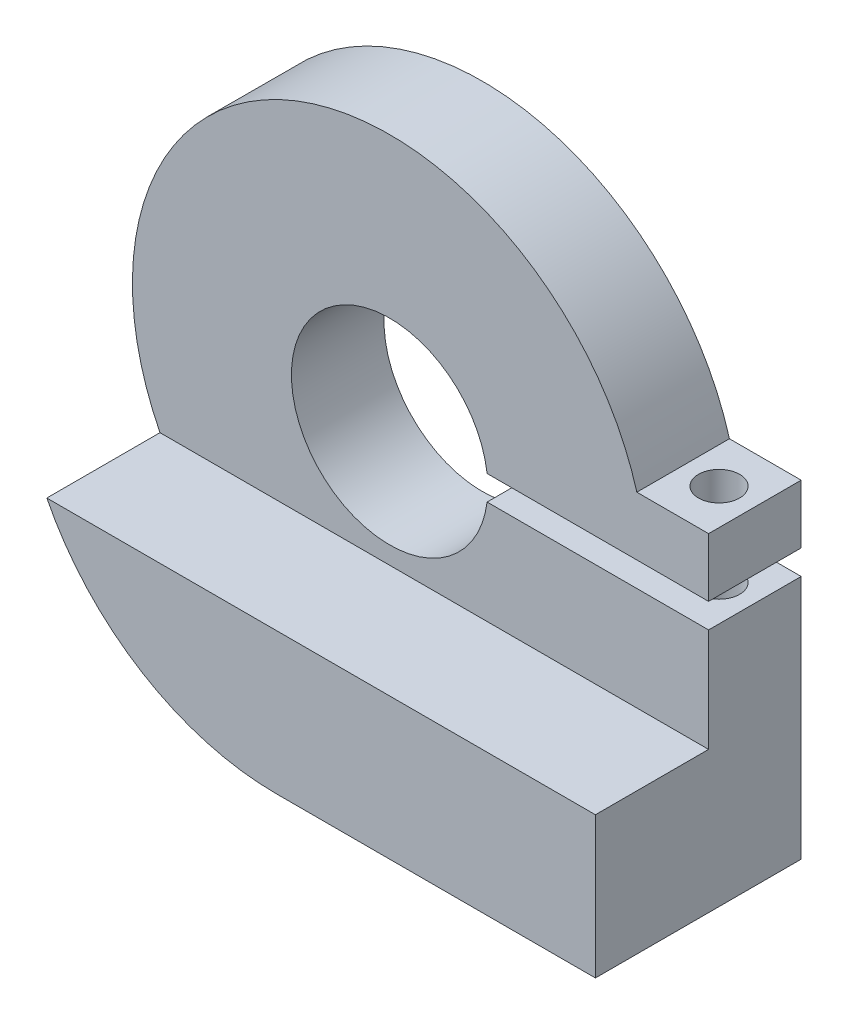
ISO-10303-21;
HEADER;
FILE_DESCRIPTION(('STEP AP214'),'2;1');
FILE_NAME('part.step','',(''),(''),'','','');
FILE_SCHEMA(('AUTOMOTIVE_DESIGN { 1 0 10303 214 1 1 1 1 }'));
ENDSEC;
DATA;
#1=APPLICATION_CONTEXT('core data for automotive mechanical design processes');
#2=APPLICATION_PROTOCOL_DEFINITION('international standard','automotive_design',2000,#1);
#3=PRODUCT_CONTEXT('',#1,'mechanical');
#4=PRODUCT('Part','Part','',(#3));
#5=PRODUCT_RELATED_PRODUCT_CATEGORY('part','',(#4));
#6=PRODUCT_DEFINITION_FORMATION('','',#4);
#7=PRODUCT_DEFINITION_CONTEXT('part definition',#1,'design');
#8=PRODUCT_DEFINITION('design','',#6,#7);
#9=PRODUCT_DEFINITION_SHAPE('','',#8);
#10=(LENGTH_UNIT() NAMED_UNIT(*) SI_UNIT(.MILLI.,.METRE.));
#11=(NAMED_UNIT(*) PLANE_ANGLE_UNIT() SI_UNIT($,.RADIAN.));
#12=(NAMED_UNIT(*) SI_UNIT($,.STERADIAN.) SOLID_ANGLE_UNIT());
#13=UNCERTAINTY_MEASURE_WITH_UNIT(LENGTH_MEASURE(1.E-05),#10,'distance_accuracy_value','');
#14=(GEOMETRIC_REPRESENTATION_CONTEXT(3) GLOBAL_UNCERTAINTY_ASSIGNED_CONTEXT((#13)) GLOBAL_UNIT_ASSIGNED_CONTEXT((#10,
#11,#12)) REPRESENTATION_CONTEXT('',''));
#15=CARTESIAN_POINT('',(0.,0.,0.));
#16=DIRECTION('',(0.,0.,1.));
#17=DIRECTION('',(1.,0.,0.));
#18=AXIS2_PLACEMENT_3D('',#15,#16,#17);
#19=CARTESIAN_POINT('',(15.5,0.6,4.5));
#20=DIRECTION('',(0.,-1.,0.));
#21=DIRECTION('',(0.,0.,-1.));
#22=AXIS2_PLACEMENT_3D('',#19,#20,#21);
#23=PLANE('',#22);
#24=CARTESIAN_POINT('',(13.7568758236732,0.6,2.25));
#25=DIRECTION('',(0.,-1.,0.));
#26=DIRECTION('',(0.,0.,-1.));
#27=AXIS2_PLACEMENT_3D('',#24,#25,#26);
#28=CIRCLE('',#27,1.);
#29=CARTESIAN_POINT('',(13.7568758236732,0.6,1.25));
#30=VERTEX_POINT('',#29);
#31=EDGE_CURVE('E256',#30,#30,#28,.T.);
#32=ORIENTED_EDGE('',*,*,#31,.F.);
#33=EDGE_LOOP('',(#32));
#34=FACE_BOUND('',#33,.T.);
#35=DIRECTION('',(-1.,0.,0.));
#36=VECTOR('',#35,1.);
#37=CARTESIAN_POINT('',(15.5,0.6,0.));
#38=LINE('',#37,#36);
#39=CARTESIAN_POINT('',(15.5,0.6,0.));
#40=VERTEX_POINT('',#39);
#41=CARTESIAN_POINT('',(4.73595100690393,0.6,0.));
#42=VERTEX_POINT('',#41);
#43=EDGE_CURVE('E153',#40,#42,#38,.T.);
#44=ORIENTED_EDGE('',*,*,#43,.F.);
#45=DIRECTION('',(0.,0.,-1.));
#46=VECTOR('',#45,1.);
#47=CARTESIAN_POINT('',(15.5,0.6,4.5));
#48=LINE('',#47,#46);
#49=CARTESIAN_POINT('',(15.5,0.6,4.5));
#50=VERTEX_POINT('',#49);
#51=EDGE_CURVE('E11',#50,#40,#48,.T.);
#52=ORIENTED_EDGE('',*,*,#51,.F.);
#53=DIRECTION('',(-1.,0.,0.));
#54=VECTOR('',#53,1.);
#55=CARTESIAN_POINT('',(15.5,0.6,4.5));
#56=LINE('',#55,#54);
#57=CARTESIAN_POINT('',(4.73595100690393,0.6,4.5));
#58=VERTEX_POINT('',#57);
#59=EDGE_CURVE('E179',#50,#58,#56,.T.);
#60=ORIENTED_EDGE('',*,*,#59,.T.);
#61=DIRECTION('',(0.,0.,-1.));
#62=VECTOR('',#61,1.);
#63=CARTESIAN_POINT('',(4.73595100690393,0.6,4.5));
#64=LINE('',#63,#62);
#65=EDGE_CURVE('E105',#58,#42,#64,.T.);
#66=ORIENTED_EDGE('',*,*,#65,.T.);
#67=EDGE_LOOP('',(#44,#52,#60,#66));
#68=FACE_BOUND('',#67,.T.);
#69=ADVANCED_FACE('F43',(#34,#68),#23,.T.);
#70=CARTESIAN_POINT('',(15.5,0.6,4.5));
#71=DIRECTION('',(-1.,0.,0.));
#72=DIRECTION('',(0.,0.,1.));
#73=AXIS2_PLACEMENT_3D('',#70,#71,#72);
#74=PLANE('',#73);
#75=DIRECTION('',(0.,1.,0.));
#76=VECTOR('',#75,1.);
#77=CARTESIAN_POINT('',(15.5,0.6,0.));
#78=LINE('',#77,#76);
#79=CARTESIAN_POINT('',(15.5,3.45250218767224,0.));
#80=VERTEX_POINT('',#79);
#81=EDGE_CURVE('E177',#40,#80,#78,.T.);
#82=ORIENTED_EDGE('',*,*,#81,.T.);
#83=DIRECTION('',(0.,0.,-1.));
#84=VECTOR('',#83,1.);
#85=CARTESIAN_POINT('',(15.5,3.45250218767224,4.5));
#86=LINE('',#85,#84);
#87=CARTESIAN_POINT('',(15.5,3.45250218767224,4.5));
#88=VERTEX_POINT('',#87);
#89=EDGE_CURVE('E52',#88,#80,#86,.T.);
#90=ORIENTED_EDGE('',*,*,#89,.F.);
#91=DIRECTION('',(0.,1.,0.));
#92=VECTOR('',#91,1.);
#93=CARTESIAN_POINT('',(15.5,0.6,4.5));
#94=LINE('',#93,#92);
#95=EDGE_CURVE('E122',#50,#88,#94,.T.);
#96=ORIENTED_EDGE('',*,*,#95,.F.);
#97=ORIENTED_EDGE('',*,*,#51,.T.);
#98=EDGE_LOOP('',(#82,#90,#96,#97));
#99=FACE_BOUND('',#98,.T.);
#100=ADVANCED_FACE('F202',(#99),#74,.F.);
#101=CARTESIAN_POINT('',(15.5,3.45250218767224,4.5));
#102=DIRECTION('',(0.,-1.,0.));
#103=DIRECTION('',(1.,0.,0.));
#104=AXIS2_PLACEMENT_3D('',#101,#102,#103);
#105=PLANE('',#104);
#106=CARTESIAN_POINT('',(13.7568758236732,3.45250218767224,2.25));
#107=DIRECTION('',(0.,1.,0.));
#108=DIRECTION('',(-1.,0.,0.));
#109=AXIS2_PLACEMENT_3D('',#106,#107,#108);
#110=CIRCLE('',#109,1.);
#111=CARTESIAN_POINT('',(12.7568758236732,3.45250218767224,2.25));
#112=VERTEX_POINT('',#111);
#113=EDGE_CURVE('E263',#112,#112,#110,.T.);
#114=ORIENTED_EDGE('',*,*,#113,.F.);
#115=EDGE_LOOP('',(#114));
#116=FACE_BOUND('',#115,.T.);
#117=DIRECTION('',(-1.,0.,0.));
#118=VECTOR('',#117,1.);
#119=CARTESIAN_POINT('',(15.5,3.45250218767224,0.));
#120=LINE('',#119,#118);
#121=CARTESIAN_POINT('',(12.0137516473464,3.45250218767224,0.));
#122=VERTEX_POINT('',#121);
#123=EDGE_CURVE('E132',#80,#122,#120,.T.);
#124=ORIENTED_EDGE('',*,*,#123,.T.);
#125=DIRECTION('',(0.,0.,-1.));
#126=VECTOR('',#125,1.);
#127=CARTESIAN_POINT('',(12.0137516473464,3.45250218767224,4.5));
#128=LINE('',#127,#126);
#129=CARTESIAN_POINT('',(12.0137516473464,3.45250218767224,4.5));
#130=VERTEX_POINT('',#129);
#131=EDGE_CURVE('E129',#130,#122,#128,.T.);
#132=ORIENTED_EDGE('',*,*,#131,.F.);
#133=DIRECTION('',(-1.,0.,0.));
#134=VECTOR('',#133,1.);
#135=CARTESIAN_POINT('',(15.5,3.45250218767224,4.5));
#136=LINE('',#135,#134);
#137=EDGE_CURVE('E116',#88,#130,#136,.T.);
#138=ORIENTED_EDGE('',*,*,#137,.F.);
#139=ORIENTED_EDGE('',*,*,#89,.T.);
#140=EDGE_LOOP('',(#124,#132,#138,#139));
#141=FACE_BOUND('',#140,.T.);
#142=ADVANCED_FACE('F130',(#116,#141),#105,.F.);
#143=CARTESIAN_POINT('',(0.,0.,4.5));
#144=DIRECTION('',(0.,0.,-1.));
#145=DIRECTION('',(-1.,0.,0.));
#146=AXIS2_PLACEMENT_3D('',#143,#144,#145);
#147=CYLINDRICAL_SURFACE('',#146,12.5);
#148=CARTESIAN_POINT('',(0.,0.,0.));
#149=DIRECTION('',(0.,0.,1.));
#150=DIRECTION('',(1.,0.,0.));
#151=AXIS2_PLACEMENT_3D('',#148,#149,#150);
#152=CIRCLE('',#151,12.5);
#153=CARTESIAN_POINT('',(0.,-12.5,0.));
#154=VERTEX_POINT('',#153);
#155=EDGE_CURVE('E172',#122,#154,#152,.T.);
#156=ORIENTED_EDGE('',*,*,#155,.T.);
#157=DIRECTION('',(0.,0.,-1.));
#158=VECTOR('',#157,1.);
#159=CARTESIAN_POINT('',(0.,-12.5,4.5));
#160=LINE('',#159,#158);
#161=CARTESIAN_POINT('',(0.,-12.5,10.));
#162=VERTEX_POINT('',#161);
#163=EDGE_CURVE('E136',#162,#154,#160,.T.);
#164=ORIENTED_EDGE('',*,*,#163,.F.);
#165=CARTESIAN_POINT('',(0.,0.,10.));
#166=DIRECTION('',(0.,0.,1.));
#167=DIRECTION('',(1.,0.,0.));
#168=AXIS2_PLACEMENT_3D('',#165,#166,#167);
#169=CIRCLE('',#168,12.5);
#170=CARTESIAN_POINT('',(-11.1609537814563,-5.62877523873498,10.));
#171=VERTEX_POINT('',#170);
#172=EDGE_CURVE('E245',#171,#162,#169,.T.);
#173=ORIENTED_EDGE('',*,*,#172,.F.);
#174=DIRECTION('',(0.,0.,-1.));
#175=VECTOR('',#174,1.);
#176=CARTESIAN_POINT('',(-11.1609537814563,-5.62877523873498,10.));
#177=LINE('',#176,#175);
#178=CARTESIAN_POINT('',(-11.1609537814563,-5.62877523873498,4.5));
#179=VERTEX_POINT('',#178);
#180=EDGE_CURVE('E142',#171,#179,#177,.T.);
#181=ORIENTED_EDGE('',*,*,#180,.T.);
#182=CARTESIAN_POINT('',(0.,0.,4.5));
#183=DIRECTION('',(0.,0.,1.));
#184=DIRECTION('',(1.,0.,0.));
#185=AXIS2_PLACEMENT_3D('',#182,#183,#184);
#186=CIRCLE('',#185,12.5);
#187=EDGE_CURVE('E120',#130,#179,#186,.T.);
#188=ORIENTED_EDGE('',*,*,#187,.F.);
#189=ORIENTED_EDGE('',*,*,#131,.T.);
#190=EDGE_LOOP('',(#156,#164,#173,#181,#188,#189));
#191=FACE_BOUND('',#190,.T.);
#192=ADVANCED_FACE('F139',(#191),#147,.T.);
#193=CARTESIAN_POINT('',(0.,-12.5,4.5));
#194=DIRECTION('',(0.,1.,0.));
#195=DIRECTION('',(0.,0.,1.));
#196=AXIS2_PLACEMENT_3D('',#193,#194,#195);
#197=PLANE('',#196);
#198=DIRECTION('',(1.,0.,0.));
#199=VECTOR('',#198,1.);
#200=CARTESIAN_POINT('',(0.,-12.5,0.));
#201=LINE('',#200,#199);
#202=CARTESIAN_POINT('',(15.5,-12.5,0.));
#203=VERTEX_POINT('',#202);
#204=EDGE_CURVE('E169',#154,#203,#201,.T.);
#205=ORIENTED_EDGE('',*,*,#204,.T.);
#206=DIRECTION('',(0.,0.,-1.));
#207=VECTOR('',#206,1.);
#208=CARTESIAN_POINT('',(15.5,-12.5,4.5));
#209=LINE('',#208,#207);
#210=CARTESIAN_POINT('',(15.5,-12.5,10.));
#211=VERTEX_POINT('',#210);
#212=EDGE_CURVE('E186',#211,#203,#209,.T.);
#213=ORIENTED_EDGE('',*,*,#212,.F.);
#214=DIRECTION('',(-1.,0.,0.));
#215=VECTOR('',#214,1.);
#216=CARTESIAN_POINT('',(15.5,-12.5,10.));
#217=LINE('',#216,#215);
#218=EDGE_CURVE('E229',#211,#162,#217,.T.);
#219=ORIENTED_EDGE('',*,*,#218,.T.);
#220=ORIENTED_EDGE('',*,*,#163,.T.);
#221=EDGE_LOOP('',(#205,#213,#219,#220));
#222=FACE_BOUND('',#221,.T.);
#223=ADVANCED_FACE('F227',(#222),#197,.F.);
#224=CARTESIAN_POINT('',(15.5,-12.5,4.5));
#225=DIRECTION('',(-1.,0.,0.));
#226=DIRECTION('',(0.,0.,1.));
#227=AXIS2_PLACEMENT_3D('',#224,#225,#226);
#228=PLANE('',#227);
#229=DIRECTION('',(0.,1.,0.));
#230=VECTOR('',#229,1.);
#231=CARTESIAN_POINT('',(15.5,-12.5,0.));
#232=LINE('',#231,#230);
#233=CARTESIAN_POINT('',(15.5,-0.6,0.));
#234=VERTEX_POINT('',#233);
#235=EDGE_CURVE('E166',#203,#234,#232,.T.);
#236=ORIENTED_EDGE('',*,*,#235,.T.);
#237=DIRECTION('',(0.,0.,-1.));
#238=VECTOR('',#237,1.);
#239=CARTESIAN_POINT('',(15.5,-0.6,4.5));
#240=LINE('',#239,#238);
#241=CARTESIAN_POINT('',(15.5,-0.6,4.5));
#242=VERTEX_POINT('',#241);
#243=EDGE_CURVE('E190',#242,#234,#240,.T.);
#244=ORIENTED_EDGE('',*,*,#243,.F.);
#245=DIRECTION('',(0.,1.,0.));
#246=VECTOR('',#245,1.);
#247=CARTESIAN_POINT('',(15.5,-12.5,4.5));
#248=LINE('',#247,#246);
#249=CARTESIAN_POINT('',(15.5,-5.62877523873498,4.5));
#250=VERTEX_POINT('',#249);
#251=EDGE_CURVE('E144',#250,#242,#248,.T.);
#252=ORIENTED_EDGE('',*,*,#251,.F.);
#253=DIRECTION('',(0.,0.,-1.));
#254=VECTOR('',#253,1.);
#255=CARTESIAN_POINT('',(15.5,-5.62877523873498,10.));
#256=LINE('',#255,#254);
#257=CARTESIAN_POINT('',(15.5,-5.62877523873498,10.));
#258=VERTEX_POINT('',#257);
#259=EDGE_CURVE('E158',#258,#250,#256,.T.);
#260=ORIENTED_EDGE('',*,*,#259,.F.);
#261=DIRECTION('',(0.,1.,0.));
#262=VECTOR('',#261,1.);
#263=CARTESIAN_POINT('',(15.5,-12.5,10.));
#264=LINE('',#263,#262);
#265=EDGE_CURVE('E223',#211,#258,#264,.T.);
#266=ORIENTED_EDGE('',*,*,#265,.F.);
#267=ORIENTED_EDGE('',*,*,#212,.T.);
#268=EDGE_LOOP('',(#236,#244,#252,#260,#266,#267));
#269=FACE_BOUND('',#268,.T.);
#270=ADVANCED_FACE('F218',(#269),#228,.F.);
#271=CARTESIAN_POINT('',(15.5,-0.6,4.5));
#272=DIRECTION('',(0.,-1.,0.));
#273=DIRECTION('',(0.,0.,-1.));
#274=AXIS2_PLACEMENT_3D('',#271,#272,#273);
#275=PLANE('',#274);
#276=CARTESIAN_POINT('',(13.7568758236732,-0.6,2.25));
#277=DIRECTION('',(0.,-1.,0.));
#278=DIRECTION('',(0.,0.,-1.));
#279=AXIS2_PLACEMENT_3D('',#276,#277,#278);
#280=CIRCLE('',#279,1.);
#281=CARTESIAN_POINT('',(13.7568758236732,-0.6,1.25));
#282=VERTEX_POINT('',#281);
#283=EDGE_CURVE('E46',#282,#282,#280,.T.);
#284=ORIENTED_EDGE('',*,*,#283,.T.);
#285=EDGE_LOOP('',(#284));
#286=FACE_BOUND('',#285,.T.);
#287=DIRECTION('',(-1.,0.,0.));
#288=VECTOR('',#287,1.);
#289=CARTESIAN_POINT('',(15.5,-0.6,0.));
#290=LINE('',#289,#288);
#291=CARTESIAN_POINT('',(4.73595100690393,-0.600000000000003,0.));
#292=VERTEX_POINT('',#291);
#293=EDGE_CURVE('E162',#234,#292,#290,.T.);
#294=ORIENTED_EDGE('',*,*,#293,.T.);
#295=DIRECTION('',(0.,0.,-1.));
#296=VECTOR('',#295,1.);
#297=CARTESIAN_POINT('',(4.73595100690393,-0.600000000000003,4.5));
#298=LINE('',#297,#296);
#299=CARTESIAN_POINT('',(4.73595100690393,-0.600000000000003,4.5));
#300=VERTEX_POINT('',#299);
#301=EDGE_CURVE('E194',#300,#292,#298,.T.);
#302=ORIENTED_EDGE('',*,*,#301,.F.);
#303=DIRECTION('',(-1.,0.,0.));
#304=VECTOR('',#303,1.);
#305=CARTESIAN_POINT('',(15.5,-0.6,4.5));
#306=LINE('',#305,#304);
#307=EDGE_CURVE('E147',#242,#300,#306,.T.);
#308=ORIENTED_EDGE('',*,*,#307,.F.);
#309=ORIENTED_EDGE('',*,*,#243,.T.);
#310=EDGE_LOOP('',(#294,#302,#308,#309));
#311=FACE_BOUND('',#310,.T.);
#312=ADVANCED_FACE('F214',(#286,#311),#275,.F.);
#313=CARTESIAN_POINT('',(0.,0.,4.5));
#314=DIRECTION('',(0.,0.,-1.));
#315=DIRECTION('',(-1.,0.,0.));
#316=AXIS2_PLACEMENT_3D('',#313,#314,#315);
#317=CYLINDRICAL_SURFACE('',#316,4.77380686033635);
#318=CARTESIAN_POINT('',(0.,0.,0.));
#319=DIRECTION('',(0.,0.,1.));
#320=DIRECTION('',(1.,0.,0.));
#321=AXIS2_PLACEMENT_3D('',#318,#319,#320);
#322=CIRCLE('',#321,4.77380686033635);
#323=EDGE_CURVE('E157',#42,#292,#322,.T.);
#324=ORIENTED_EDGE('',*,*,#323,.F.);
#325=ORIENTED_EDGE('',*,*,#65,.F.);
#326=CARTESIAN_POINT('',(0.,0.,4.5));
#327=DIRECTION('',(0.,0.,1.));
#328=DIRECTION('',(1.,0.,0.));
#329=AXIS2_PLACEMENT_3D('',#326,#327,#328);
#330=CIRCLE('',#329,4.77380686033635);
#331=EDGE_CURVE('E203',#58,#300,#330,.T.);
#332=ORIENTED_EDGE('',*,*,#331,.T.);
#333=ORIENTED_EDGE('',*,*,#301,.T.);
#334=EDGE_LOOP('',(#324,#325,#332,#333));
#335=FACE_BOUND('',#334,.T.);
#336=ADVANCED_FACE('F197',(#335),#317,.F.);
#337=CARTESIAN_POINT('',(0.,0.,4.5));
#338=DIRECTION('',(0.,0.,1.));
#339=DIRECTION('',(1.,0.,0.));
#340=AXIS2_PLACEMENT_3D('',#337,#338,#339);
#341=PLANE('',#340);
#342=DIRECTION('',(-1.,0.,0.));
#343=VECTOR('',#342,1.);
#344=CARTESIAN_POINT('',(15.5,-5.62877523873498,4.5));
#345=LINE('',#344,#343);
#346=EDGE_CURVE('E60',#250,#179,#345,.T.);
#347=ORIENTED_EDGE('',*,*,#346,.F.);
#348=ORIENTED_EDGE('',*,*,#251,.T.);
#349=ORIENTED_EDGE('',*,*,#307,.T.);
#350=ORIENTED_EDGE('',*,*,#331,.F.);
#351=ORIENTED_EDGE('',*,*,#59,.F.);
#352=ORIENTED_EDGE('',*,*,#95,.T.);
#353=ORIENTED_EDGE('',*,*,#137,.T.);
#354=ORIENTED_EDGE('',*,*,#187,.T.);
#355=EDGE_LOOP('',(#347,#348,#349,#350,#351,#352,#353,#354));
#356=FACE_BOUND('',#355,.T.);
#357=ADVANCED_FACE('F118',(#356),#341,.T.);
#358=CARTESIAN_POINT('',(0.,0.,0.));
#359=DIRECTION('',(0.,0.,1.));
#360=DIRECTION('',(1.,0.,0.));
#361=AXIS2_PLACEMENT_3D('',#358,#359,#360);
#362=PLANE('',#361);
#363=ORIENTED_EDGE('',*,*,#43,.T.);
#364=ORIENTED_EDGE('',*,*,#323,.T.);
#365=ORIENTED_EDGE('',*,*,#293,.F.);
#366=ORIENTED_EDGE('',*,*,#235,.F.);
#367=ORIENTED_EDGE('',*,*,#204,.F.);
#368=ORIENTED_EDGE('',*,*,#155,.F.);
#369=ORIENTED_EDGE('',*,*,#123,.F.);
#370=ORIENTED_EDGE('',*,*,#81,.F.);
#371=EDGE_LOOP('',(#363,#364,#365,#366,#367,#368,#369,#370));
#372=FACE_BOUND('',#371,.T.);
#373=ADVANCED_FACE('F201',(#372),#362,.F.);
#374=CARTESIAN_POINT('',(15.5,-5.62877523873498,10.));
#375=DIRECTION('',(0.,-1.,0.));
#376=DIRECTION('',(0.,0.,-1.));
#377=AXIS2_PLACEMENT_3D('',#374,#375,#376);
#378=PLANE('',#377);
#379=ORIENTED_EDGE('',*,*,#346,.T.);
#380=ORIENTED_EDGE('',*,*,#180,.F.);
#381=DIRECTION('',(-1.,0.,0.));
#382=VECTOR('',#381,1.);
#383=CARTESIAN_POINT('',(15.5,-5.62877523873498,10.));
#384=LINE('',#383,#382);
#385=EDGE_CURVE('E240',#258,#171,#384,.T.);
#386=ORIENTED_EDGE('',*,*,#385,.F.);
#387=ORIENTED_EDGE('',*,*,#259,.T.);
#388=EDGE_LOOP('',(#379,#380,#386,#387));
#389=FACE_BOUND('',#388,.T.);
#390=ADVANCED_FACE('F241',(#389),#378,.F.);
#391=CARTESIAN_POINT('',(0.,0.,10.));
#392=DIRECTION('',(0.,0.,1.));
#393=DIRECTION('',(1.,0.,0.));
#394=AXIS2_PLACEMENT_3D('',#391,#392,#393);
#395=PLANE('',#394);
#396=ORIENTED_EDGE('',*,*,#265,.T.);
#397=ORIENTED_EDGE('',*,*,#385,.T.);
#398=ORIENTED_EDGE('',*,*,#172,.T.);
#399=ORIENTED_EDGE('',*,*,#218,.F.);
#400=EDGE_LOOP('',(#396,#397,#398,#399));
#401=FACE_BOUND('',#400,.T.);
#402=ADVANCED_FACE('F247',(#401),#395,.T.);
#403=CARTESIAN_POINT('',(13.7568758236732,-2.04749781232776,2.25));
#404=DIRECTION('',(0.,1.,0.));
#405=DIRECTION('',(-1.,0.,0.));
#406=AXIS2_PLACEMENT_3D('',#403,#404,#405);
#407=PLANE('',#406);
#408=CARTESIAN_POINT('',(13.7568758236732,-2.04749781232776,2.25));
#409=DIRECTION('',(0.,1.,0.));
#410=DIRECTION('',(-1.,0.,0.));
#411=AXIS2_PLACEMENT_3D('',#408,#409,#410);
#412=CIRCLE('',#411,1.);
#413=CARTESIAN_POINT('',(12.7568758236732,-2.04749781232776,2.25));
#414=VERTEX_POINT('',#413);
#415=EDGE_CURVE('E267',#414,#414,#412,.T.);
#416=ORIENTED_EDGE('',*,*,#415,.T.);
#417=EDGE_LOOP('',(#416));
#418=FACE_BOUND('',#417,.T.);
#419=ADVANCED_FACE('F280',(#418),#407,.T.);
#420=CARTESIAN_POINT('',(13.7568758236732,-2.04749781232776,2.25));
#421=DIRECTION('',(0.,1.,0.));
#422=DIRECTION('',(-1.,0.,0.));
#423=AXIS2_PLACEMENT_3D('',#420,#421,#422);
#424=CYLINDRICAL_SURFACE('',#423,1.);
#425=ORIENTED_EDGE('',*,*,#415,.F.);
#426=EDGE_LOOP('',(#425));
#427=FACE_BOUND('',#426,.T.);
#428=ORIENTED_EDGE('',*,*,#283,.F.);
#429=EDGE_LOOP('',(#428));
#430=FACE_BOUND('',#429,.T.);
#431=ADVANCED_FACE('F277',(#427,#430),#424,.F.);
#432=ORIENTED_EDGE('',*,*,#31,.T.);
#433=EDGE_LOOP('',(#432));
#434=FACE_BOUND('',#433,.T.);
#435=ORIENTED_EDGE('',*,*,#113,.T.);
#436=EDGE_LOOP('',(#435));
#437=FACE_BOUND('',#436,.T.);
#438=ADVANCED_FACE('F279',(#434,#437),#424,.F.);
#439=CLOSED_SHELL('',(#69,#100,#142,#192,#223,#270,#312,#336,#357,#373,#390,#402,#419,#431,#438));
#440=MANIFOLD_SOLID_BREP('B2',#439);
#441=ADVANCED_BREP_SHAPE_REPRESENTATION('',(#18,#440),#14);
#442=SHAPE_DEFINITION_REPRESENTATION(#9,#441);
ENDSEC;
END-ISO-10303-21;
